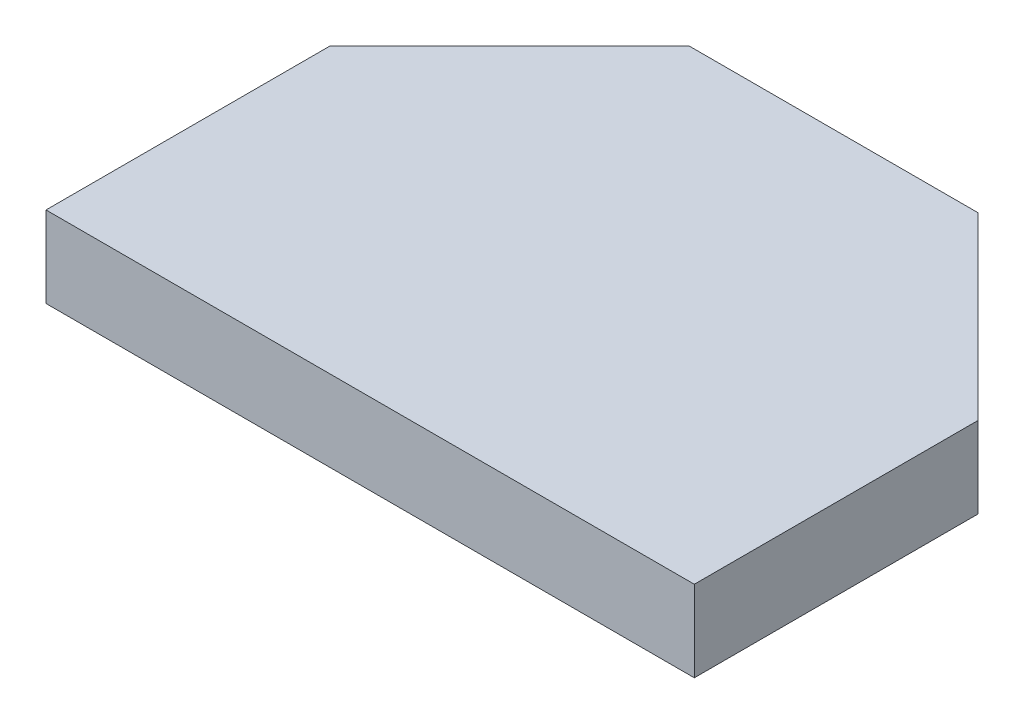
ISO-10303-21;
HEADER;
FILE_DESCRIPTION(('STEP AP214'),'2;1');
FILE_NAME('part.step','',(''),(''),'','','');
FILE_SCHEMA(('AUTOMOTIVE_DESIGN { 1 0 10303 214 1 1 1 1 }'));
ENDSEC;
DATA;
#1=APPLICATION_CONTEXT('core data for automotive mechanical design processes');
#2=APPLICATION_PROTOCOL_DEFINITION('international standard','automotive_design',2000,#1);
#3=PRODUCT_CONTEXT('',#1,'mechanical');
#4=PRODUCT('Part','Part','',(#3));
#5=PRODUCT_RELATED_PRODUCT_CATEGORY('part','',(#4));
#6=PRODUCT_DEFINITION_FORMATION('','',#4);
#7=PRODUCT_DEFINITION_CONTEXT('part definition',#1,'design');
#8=PRODUCT_DEFINITION('design','',#6,#7);
#9=PRODUCT_DEFINITION_SHAPE('','',#8);
#10=(LENGTH_UNIT() NAMED_UNIT(*) SI_UNIT(.MILLI.,.METRE.));
#11=(NAMED_UNIT(*) PLANE_ANGLE_UNIT() SI_UNIT($,.RADIAN.));
#12=(NAMED_UNIT(*) SI_UNIT($,.STERADIAN.) SOLID_ANGLE_UNIT());
#13=UNCERTAINTY_MEASURE_WITH_UNIT(LENGTH_MEASURE(1.E-05),#10,'distance_accuracy_value','');
#14=(GEOMETRIC_REPRESENTATION_CONTEXT(3) GLOBAL_UNCERTAINTY_ASSIGNED_CONTEXT((#13)) GLOBAL_UNIT_ASSIGNED_CONTEXT((#10,
#11,#12)) REPRESENTATION_CONTEXT('',''));
#15=CARTESIAN_POINT('',(0.,0.,0.));
#16=DIRECTION('',(0.,0.,1.));
#17=DIRECTION('',(1.,0.,0.));
#18=AXIS2_PLACEMENT_3D('',#15,#16,#17);
#19=CARTESIAN_POINT('',(0.,12.7,0.));
#20=DIRECTION('',(1.,0.,0.));
#21=DIRECTION('',(0.,0.,-1.));
#22=AXIS2_PLACEMENT_3D('',#19,#20,#21);
#23=PLANE('',#22);
#24=DIRECTION('',(0.,0.,1.));
#25=VECTOR('',#24,1.);
#26=CARTESIAN_POINT('',(0.,0.,0.));
#27=LINE('',#26,#25);
#28=CARTESIAN_POINT('',(0.,0.,-44.45));
#29=VERTEX_POINT('',#28);
#30=CARTESIAN_POINT('',(0.,0.,0.));
#31=VERTEX_POINT('',#30);
#32=EDGE_CURVE('E117',#29,#31,#27,.T.);
#33=ORIENTED_EDGE('',*,*,#32,.T.);
#34=DIRECTION('',(0.,-1.,0.));
#35=VECTOR('',#34,1.);
#36=CARTESIAN_POINT('',(0.,12.7,0.));
#37=LINE('',#36,#35);
#38=CARTESIAN_POINT('',(0.,12.7,0.));
#39=VERTEX_POINT('',#38);
#40=EDGE_CURVE('E11',#39,#31,#37,.T.);
#41=ORIENTED_EDGE('',*,*,#40,.F.);
#42=DIRECTION('',(0.,0.,1.));
#43=VECTOR('',#42,1.);
#44=CARTESIAN_POINT('',(0.,12.7,0.));
#45=LINE('',#44,#43);
#46=CARTESIAN_POINT('',(0.,12.7,-44.45));
#47=VERTEX_POINT('',#46);
#48=EDGE_CURVE('E127',#47,#39,#45,.T.);
#49=ORIENTED_EDGE('',*,*,#48,.F.);
#50=DIRECTION('',(0.,-1.,0.));
#51=VECTOR('',#50,1.);
#52=CARTESIAN_POINT('',(0.,12.7,-44.45));
#53=LINE('',#52,#51);
#54=EDGE_CURVE('E113',#47,#29,#53,.T.);
#55=ORIENTED_EDGE('',*,*,#54,.T.);
#56=EDGE_LOOP('',(#33,#41,#49,#55));
#57=FACE_BOUND('',#56,.T.);
#58=ADVANCED_FACE('F33',(#57),#23,.F.);
#59=CARTESIAN_POINT('',(0.,12.7,0.));
#60=DIRECTION('',(0.,0.,-1.));
#61=DIRECTION('',(-1.,0.,0.));
#62=AXIS2_PLACEMENT_3D('',#59,#60,#61);
#63=PLANE('',#62);
#64=DIRECTION('',(1.,0.,0.));
#65=VECTOR('',#64,1.);
#66=CARTESIAN_POINT('',(0.,0.,0.));
#67=LINE('',#66,#65);
#68=CARTESIAN_POINT('',(101.6,0.,0.));
#69=VERTEX_POINT('',#68);
#70=EDGE_CURVE('E120',#31,#69,#67,.T.);
#71=ORIENTED_EDGE('',*,*,#70,.T.);
#72=DIRECTION('',(0.,-1.,0.));
#73=VECTOR('',#72,1.);
#74=CARTESIAN_POINT('',(101.6,12.7,0.));
#75=LINE('',#74,#73);
#76=CARTESIAN_POINT('',(101.6,12.7,0.));
#77=VERTEX_POINT('',#76);
#78=EDGE_CURVE('E41',#77,#69,#75,.T.);
#79=ORIENTED_EDGE('',*,*,#78,.F.);
#80=DIRECTION('',(1.,0.,0.));
#81=VECTOR('',#80,1.);
#82=CARTESIAN_POINT('',(0.,12.7,0.));
#83=LINE('',#82,#81);
#84=EDGE_CURVE('E86',#39,#77,#83,.T.);
#85=ORIENTED_EDGE('',*,*,#84,.F.);
#86=ORIENTED_EDGE('',*,*,#40,.T.);
#87=EDGE_LOOP('',(#71,#79,#85,#86));
#88=FACE_BOUND('',#87,.T.);
#89=ADVANCED_FACE('F151',(#88),#63,.F.);
#90=CARTESIAN_POINT('',(101.6,12.7,0.));
#91=DIRECTION('',(-1.,0.,0.));
#92=DIRECTION('',(0.,0.,1.));
#93=AXIS2_PLACEMENT_3D('',#90,#91,#92);
#94=PLANE('',#93);
#95=DIRECTION('',(0.,0.,-1.));
#96=VECTOR('',#95,1.);
#97=CARTESIAN_POINT('',(101.6,0.,0.));
#98=LINE('',#97,#96);
#99=CARTESIAN_POINT('',(101.6,0.,-44.45));
#100=VERTEX_POINT('',#99);
#101=EDGE_CURVE('E122',#69,#100,#98,.T.);
#102=ORIENTED_EDGE('',*,*,#101,.T.);
#103=DIRECTION('',(0.,-1.,0.));
#104=VECTOR('',#103,1.);
#105=CARTESIAN_POINT('',(101.6,12.7,-44.45));
#106=LINE('',#105,#104);
#107=CARTESIAN_POINT('',(101.6,12.7,-44.45));
#108=VERTEX_POINT('',#107);
#109=EDGE_CURVE('E108',#108,#100,#106,.T.);
#110=ORIENTED_EDGE('',*,*,#109,.F.);
#111=DIRECTION('',(0.,0.,-1.));
#112=VECTOR('',#111,1.);
#113=CARTESIAN_POINT('',(101.6,12.7,0.));
#114=LINE('',#113,#112);
#115=EDGE_CURVE('E99',#77,#108,#114,.T.);
#116=ORIENTED_EDGE('',*,*,#115,.F.);
#117=ORIENTED_EDGE('',*,*,#78,.T.);
#118=EDGE_LOOP('',(#102,#110,#116,#117));
#119=FACE_BOUND('',#118,.T.);
#120=ADVANCED_FACE('F133',(#119),#94,.F.);
#121=CARTESIAN_POINT('',(101.6,12.7,-44.45));
#122=DIRECTION('',(-0.707207178689529,0.,0.707006369426752));
#123=DIRECTION('',(0.707006369426752,0.,0.707207178689529));
#124=AXIS2_PLACEMENT_3D('',#121,#122,#123);
#125=PLANE('',#124);
#126=DIRECTION('',(-0.707006369426752,0.,-0.707207178689529));
#127=VECTOR('',#126,1.);
#128=CARTESIAN_POINT('',(101.6,0.,-44.45));
#129=LINE('',#128,#127);
#130=CARTESIAN_POINT('',(73.406,0.,-72.652007871781));
#131=VERTEX_POINT('',#130);
#132=EDGE_CURVE('E107',#100,#131,#129,.T.);
#133=ORIENTED_EDGE('',*,*,#132,.T.);
#134=DIRECTION('',(0.,-1.,0.));
#135=VECTOR('',#134,1.);
#136=CARTESIAN_POINT('',(73.406,12.7,-72.652007871781));
#137=LINE('',#136,#135);
#138=CARTESIAN_POINT('',(73.406,12.7,-72.652007871781));
#139=VERTEX_POINT('',#138);
#140=EDGE_CURVE('E104',#139,#131,#137,.T.);
#141=ORIENTED_EDGE('',*,*,#140,.F.);
#142=DIRECTION('',(-0.707006369426752,0.,-0.707207178689529));
#143=VECTOR('',#142,1.);
#144=CARTESIAN_POINT('',(101.6,12.7,-44.45));
#145=LINE('',#144,#143);
#146=EDGE_CURVE('E93',#108,#139,#145,.T.);
#147=ORIENTED_EDGE('',*,*,#146,.F.);
#148=ORIENTED_EDGE('',*,*,#109,.T.);
#149=EDGE_LOOP('',(#133,#141,#147,#148));
#150=FACE_BOUND('',#149,.T.);
#151=ADVANCED_FACE('F105',(#150),#125,.F.);
#152=CARTESIAN_POINT('',(73.406,12.7,-72.652007871781));
#153=DIRECTION('',(8.85606968224601E-05,0.,0.999999996078502));
#154=DIRECTION('',(0.999999996078502,0.,-8.85606968224601E-05));
#155=AXIS2_PLACEMENT_3D('',#152,#153,#154);
#156=PLANE('',#155);
#157=DIRECTION('',(-0.999999996078502,0.,8.85606968224601E-05));
#158=VECTOR('',#157,1.);
#159=CARTESIAN_POINT('',(73.406,0.,-72.652007871781));
#160=LINE('',#159,#158);
#161=CARTESIAN_POINT('',(28.1980042201571,0.,-72.6480042201571));
#162=VERTEX_POINT('',#161);
#163=EDGE_CURVE('E72',#131,#162,#160,.T.);
#164=ORIENTED_EDGE('',*,*,#163,.T.);
#165=DIRECTION('',(0.,-1.,0.));
#166=VECTOR('',#165,1.);
#167=CARTESIAN_POINT('',(28.1980042201571,12.7,-72.6480042201571));
#168=LINE('',#167,#166);
#169=CARTESIAN_POINT('',(28.1980042201571,12.7,-72.6480042201571));
#170=VERTEX_POINT('',#169);
#171=EDGE_CURVE('E109',#170,#162,#168,.T.);
#172=ORIENTED_EDGE('',*,*,#171,.F.);
#173=DIRECTION('',(-0.999999996078502,0.,8.85606968224601E-05));
#174=VECTOR('',#173,1.);
#175=CARTESIAN_POINT('',(73.406,12.7,-72.652007871781));
#176=LINE('',#175,#174);
#177=EDGE_CURVE('E97',#139,#170,#176,.T.);
#178=ORIENTED_EDGE('',*,*,#177,.F.);
#179=ORIENTED_EDGE('',*,*,#140,.T.);
#180=EDGE_LOOP('',(#164,#172,#178,#179));
#181=FACE_BOUND('',#180,.T.);
#182=ADVANCED_FACE('F111',(#181),#156,.F.);
#183=CARTESIAN_POINT('',(0.,12.7,-44.45));
#184=DIRECTION('',(0.707106781186547,0.,0.707106781186548));
#185=DIRECTION('',(0.707106781186548,0.,-0.707106781186547));
#186=AXIS2_PLACEMENT_3D('',#183,#184,#185);
#187=PLANE('',#186);
#188=DIRECTION('',(-0.707106781186548,0.,0.707106781186547));
#189=VECTOR('',#188,1.);
#190=CARTESIAN_POINT('',(0.,0.,-44.45));
#191=LINE('',#190,#189);
#192=EDGE_CURVE('E78',#162,#29,#191,.T.);
#193=ORIENTED_EDGE('',*,*,#192,.T.);
#194=ORIENTED_EDGE('',*,*,#54,.F.);
#195=DIRECTION('',(-0.707106781186548,0.,0.707106781186547));
#196=VECTOR('',#195,1.);
#197=CARTESIAN_POINT('',(0.,12.7,-44.45));
#198=LINE('',#197,#196);
#199=EDGE_CURVE('E49',#170,#47,#198,.T.);
#200=ORIENTED_EDGE('',*,*,#199,.F.);
#201=ORIENTED_EDGE('',*,*,#171,.T.);
#202=EDGE_LOOP('',(#193,#194,#200,#201));
#203=FACE_BOUND('',#202,.T.);
#204=ADVANCED_FACE('F140',(#203),#187,.F.);
#205=CARTESIAN_POINT('',(0.,12.7,0.));
#206=DIRECTION('',(0.,-1.,0.));
#207=DIRECTION('',(0.,0.,-1.));
#208=AXIS2_PLACEMENT_3D('',#205,#206,#207);
#209=PLANE('',#208);
#210=ORIENTED_EDGE('',*,*,#48,.T.);
#211=ORIENTED_EDGE('',*,*,#84,.T.);
#212=ORIENTED_EDGE('',*,*,#115,.T.);
#213=ORIENTED_EDGE('',*,*,#146,.T.);
#214=ORIENTED_EDGE('',*,*,#177,.T.);
#215=ORIENTED_EDGE('',*,*,#199,.T.);
#216=EDGE_LOOP('',(#210,#211,#212,#213,#214,#215));
#217=FACE_BOUND('',#216,.T.);
#218=ADVANCED_FACE('F95',(#217),#209,.F.);
#219=CARTESIAN_POINT('',(0.,0.,0.));
#220=DIRECTION('',(0.,-1.,0.));
#221=DIRECTION('',(0.,0.,-1.));
#222=AXIS2_PLACEMENT_3D('',#219,#220,#221);
#223=PLANE('',#222);
#224=ORIENTED_EDGE('',*,*,#32,.F.);
#225=ORIENTED_EDGE('',*,*,#192,.F.);
#226=ORIENTED_EDGE('',*,*,#163,.F.);
#227=ORIENTED_EDGE('',*,*,#132,.F.);
#228=ORIENTED_EDGE('',*,*,#101,.F.);
#229=ORIENTED_EDGE('',*,*,#70,.F.);
#230=EDGE_LOOP('',(#224,#225,#226,#227,#228,#229));
#231=FACE_BOUND('',#230,.T.);
#232=ADVANCED_FACE('F136',(#231),#223,.T.);
#233=CLOSED_SHELL('',(#58,#89,#120,#151,#182,#204,#218,#232));
#234=MANIFOLD_SOLID_BREP('B2',#233);
#235=ADVANCED_BREP_SHAPE_REPRESENTATION('',(#18,#234),#14);
#236=SHAPE_DEFINITION_REPRESENTATION(#9,#235);
ENDSEC;
END-ISO-10303-21;
